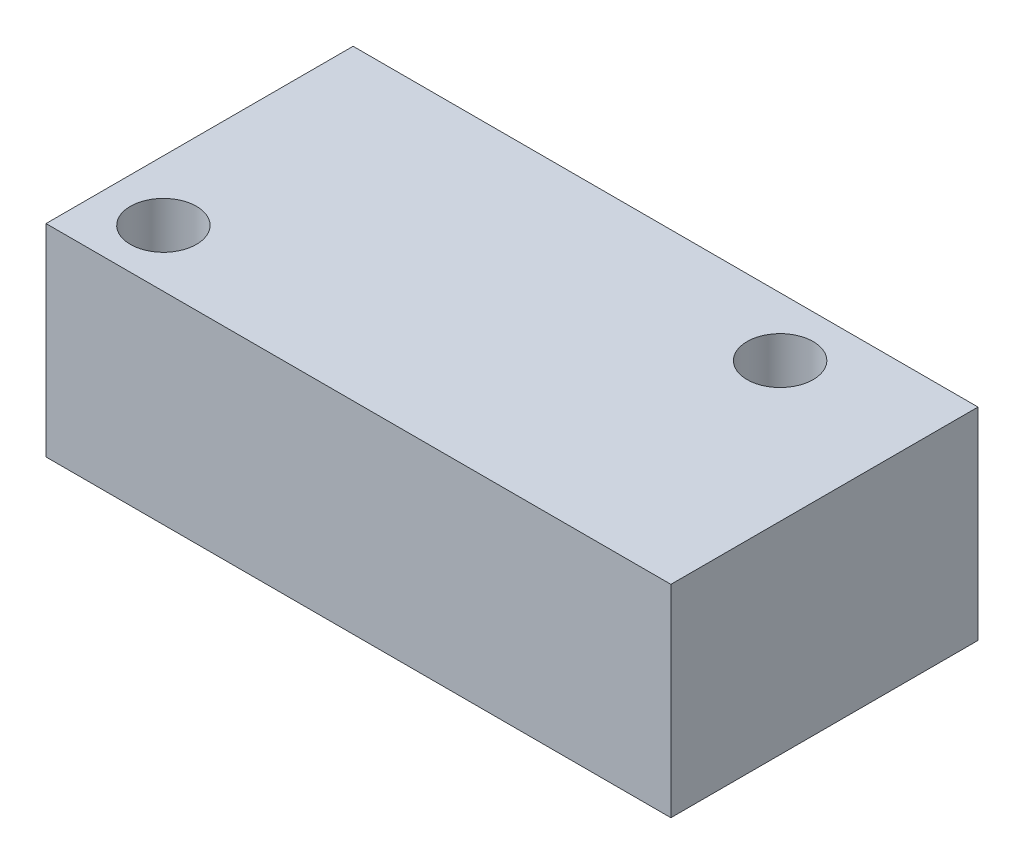
ISO-10303-21;
HEADER;
FILE_DESCRIPTION(('STEP AP214'),'2;1');
FILE_NAME('part.step','',(''),(''),'','','');
FILE_SCHEMA(('AUTOMOTIVE_DESIGN { 1 0 10303 214 1 1 1 1 }'));
ENDSEC;
DATA;
#1=APPLICATION_CONTEXT('core data for automotive mechanical design processes');
#2=APPLICATION_PROTOCOL_DEFINITION('international standard','automotive_design',2000,#1);
#3=PRODUCT_CONTEXT('',#1,'mechanical');
#4=PRODUCT('Part','Part','',(#3));
#5=PRODUCT_RELATED_PRODUCT_CATEGORY('part','',(#4));
#6=PRODUCT_DEFINITION_FORMATION('','',#4);
#7=PRODUCT_DEFINITION_CONTEXT('part definition',#1,'design');
#8=PRODUCT_DEFINITION('design','',#6,#7);
#9=PRODUCT_DEFINITION_SHAPE('','',#8);
#10=(LENGTH_UNIT() NAMED_UNIT(*) SI_UNIT(.MILLI.,.METRE.));
#11=(NAMED_UNIT(*) PLANE_ANGLE_UNIT() SI_UNIT($,.RADIAN.));
#12=(NAMED_UNIT(*) SI_UNIT($,.STERADIAN.) SOLID_ANGLE_UNIT());
#13=UNCERTAINTY_MEASURE_WITH_UNIT(LENGTH_MEASURE(1.E-05),#10,'distance_accuracy_value','');
#14=(GEOMETRIC_REPRESENTATION_CONTEXT(3) GLOBAL_UNCERTAINTY_ASSIGNED_CONTEXT((#13)) GLOBAL_UNIT_ASSIGNED_CONTEXT((#10,
#11,#12)) REPRESENTATION_CONTEXT('',''));
#15=CARTESIAN_POINT('',(0.,0.,0.));
#16=DIRECTION('',(0.,0.,1.));
#17=DIRECTION('',(1.,0.,0.));
#18=AXIS2_PLACEMENT_3D('',#15,#16,#17);
#19=CARTESIAN_POINT('',(0.,10.4,0.));
#20=DIRECTION('',(1.,0.,0.));
#21=DIRECTION('',(0.,0.,-1.));
#22=AXIS2_PLACEMENT_3D('',#19,#20,#21);
#23=PLANE('',#22);
#24=DIRECTION('',(0.,0.,1.));
#25=VECTOR('',#24,1.);
#26=CARTESIAN_POINT('',(0.,0.,0.));
#27=LINE('',#26,#25);
#28=CARTESIAN_POINT('',(0.,0.,-15.8));
#29=VERTEX_POINT('',#28);
#30=CARTESIAN_POINT('',(0.,0.,0.));
#31=VERTEX_POINT('',#30);
#32=EDGE_CURVE('E107',#29,#31,#27,.T.);
#33=ORIENTED_EDGE('',*,*,#32,.T.);
#34=DIRECTION('',(0.,-1.,0.));
#35=VECTOR('',#34,1.);
#36=CARTESIAN_POINT('',(0.,10.4,0.));
#37=LINE('',#36,#35);
#38=CARTESIAN_POINT('',(0.,10.4,0.));
#39=VERTEX_POINT('',#38);
#40=EDGE_CURVE('E11',#39,#31,#37,.T.);
#41=ORIENTED_EDGE('',*,*,#40,.F.);
#42=DIRECTION('',(0.,0.,1.));
#43=VECTOR('',#42,1.);
#44=CARTESIAN_POINT('',(0.,10.4,0.));
#45=LINE('',#44,#43);
#46=CARTESIAN_POINT('',(0.,10.4,-15.8));
#47=VERTEX_POINT('',#46);
#48=EDGE_CURVE('E91',#47,#39,#45,.T.);
#49=ORIENTED_EDGE('',*,*,#48,.F.);
#50=DIRECTION('',(0.,-1.,0.));
#51=VECTOR('',#50,1.);
#52=CARTESIAN_POINT('',(0.,10.4,-15.8));
#53=LINE('',#52,#51);
#54=EDGE_CURVE('E103',#47,#29,#53,.T.);
#55=ORIENTED_EDGE('',*,*,#54,.T.);
#56=EDGE_LOOP('',(#33,#41,#49,#55));
#57=FACE_BOUND('',#56,.T.);
#58=ADVANCED_FACE('F39',(#57),#23,.F.);
#59=CARTESIAN_POINT('',(0.,10.4,0.));
#60=DIRECTION('',(0.,0.,-1.));
#61=DIRECTION('',(-1.,0.,0.));
#62=AXIS2_PLACEMENT_3D('',#59,#60,#61);
#63=PLANE('',#62);
#64=DIRECTION('',(1.,0.,0.));
#65=VECTOR('',#64,1.);
#66=CARTESIAN_POINT('',(0.,0.,0.));
#67=LINE('',#66,#65);
#68=CARTESIAN_POINT('',(32.15,0.,0.));
#69=VERTEX_POINT('',#68);
#70=EDGE_CURVE('E96',#31,#69,#67,.T.);
#71=ORIENTED_EDGE('',*,*,#70,.T.);
#72=DIRECTION('',(0.,-1.,0.));
#73=VECTOR('',#72,1.);
#74=CARTESIAN_POINT('',(32.15,10.4,0.));
#75=LINE('',#74,#73);
#76=CARTESIAN_POINT('',(32.15,10.4,0.));
#77=VERTEX_POINT('',#76);
#78=EDGE_CURVE('E48',#77,#69,#75,.T.);
#79=ORIENTED_EDGE('',*,*,#78,.F.);
#80=DIRECTION('',(1.,0.,0.));
#81=VECTOR('',#80,1.);
#82=CARTESIAN_POINT('',(0.,10.4,0.));
#83=LINE('',#82,#81);
#84=EDGE_CURVE('E86',#39,#77,#83,.T.);
#85=ORIENTED_EDGE('',*,*,#84,.F.);
#86=ORIENTED_EDGE('',*,*,#40,.T.);
#87=EDGE_LOOP('',(#71,#79,#85,#86));
#88=FACE_BOUND('',#87,.T.);
#89=ADVANCED_FACE('F95',(#88),#63,.F.);
#90=CARTESIAN_POINT('',(32.15,10.4,0.));
#91=DIRECTION('',(-1.,0.,0.));
#92=DIRECTION('',(0.,0.,1.));
#93=AXIS2_PLACEMENT_3D('',#90,#91,#92);
#94=PLANE('',#93);
#95=DIRECTION('',(0.,0.,-1.));
#96=VECTOR('',#95,1.);
#97=CARTESIAN_POINT('',(32.15,0.,0.));
#98=LINE('',#97,#96);
#99=CARTESIAN_POINT('',(32.15,0.,-15.8));
#100=VERTEX_POINT('',#99);
#101=EDGE_CURVE('E73',#69,#100,#98,.T.);
#102=ORIENTED_EDGE('',*,*,#101,.T.);
#103=DIRECTION('',(0.,-1.,0.));
#104=VECTOR('',#103,1.);
#105=CARTESIAN_POINT('',(32.15,10.4,-15.8));
#106=LINE('',#105,#104);
#107=CARTESIAN_POINT('',(32.15,10.4,-15.8));
#108=VERTEX_POINT('',#107);
#109=EDGE_CURVE('E98',#108,#100,#106,.T.);
#110=ORIENTED_EDGE('',*,*,#109,.F.);
#111=DIRECTION('',(0.,0.,-1.));
#112=VECTOR('',#111,1.);
#113=CARTESIAN_POINT('',(32.15,10.4,0.));
#114=LINE('',#113,#112);
#115=EDGE_CURVE('E89',#77,#108,#114,.T.);
#116=ORIENTED_EDGE('',*,*,#115,.F.);
#117=ORIENTED_EDGE('',*,*,#78,.T.);
#118=EDGE_LOOP('',(#102,#110,#116,#117));
#119=FACE_BOUND('',#118,.T.);
#120=ADVANCED_FACE('F99',(#119),#94,.F.);
#121=CARTESIAN_POINT('',(0.,10.4,-15.8));
#122=DIRECTION('',(0.,0.,1.));
#123=DIRECTION('',(1.,0.,0.));
#124=AXIS2_PLACEMENT_3D('',#121,#122,#123);
#125=PLANE('',#124);
#126=CARTESIAN_POINT('',(4.87019161215807,5.2,-15.8));
#127=DIRECTION('',(0.,0.,1.));
#128=DIRECTION('',(1.,0.,0.));
#129=AXIS2_PLACEMENT_3D('',#126,#127,#128);
#130=CIRCLE('',#129,4.6);
#131=CARTESIAN_POINT('',(9.47019161215807,5.2,-15.8));
#132=VERTEX_POINT('',#131);
#133=EDGE_CURVE('E151',#132,#132,#130,.T.);
#134=ORIENTED_EDGE('',*,*,#133,.T.);
#135=EDGE_LOOP('',(#134));
#136=FACE_BOUND('',#135,.T.);
#137=DIRECTION('',(-1.,0.,0.));
#138=VECTOR('',#137,1.);
#139=CARTESIAN_POINT('',(0.,0.,-15.8));
#140=LINE('',#139,#138);
#141=EDGE_CURVE('E79',#100,#29,#140,.T.);
#142=ORIENTED_EDGE('',*,*,#141,.T.);
#143=ORIENTED_EDGE('',*,*,#54,.F.);
#144=DIRECTION('',(-1.,0.,0.));
#145=VECTOR('',#144,1.);
#146=CARTESIAN_POINT('',(0.,10.4,-15.8));
#147=LINE('',#146,#145);
#148=EDGE_CURVE('E56',#108,#47,#147,.T.);
#149=ORIENTED_EDGE('',*,*,#148,.F.);
#150=ORIENTED_EDGE('',*,*,#109,.T.);
#151=EDGE_LOOP('',(#142,#143,#149,#150));
#152=FACE_BOUND('',#151,.T.);
#153=ADVANCED_FACE('F121',(#136,#152),#125,.F.);
#154=CARTESIAN_POINT('',(0.,10.4,0.));
#155=DIRECTION('',(0.,-1.,0.));
#156=DIRECTION('',(0.,0.,-1.));
#157=AXIS2_PLACEMENT_3D('',#154,#155,#156);
#158=PLANE('',#157);
#159=CARTESIAN_POINT('',(3.1,10.4,-2.94));
#160=DIRECTION('',(0.,1.,0.));
#161=DIRECTION('',(0.,0.,1.));
#162=AXIS2_PLACEMENT_3D('',#159,#160,#161);
#163=CIRCLE('',#162,1.7);
#164=CARTESIAN_POINT('',(3.1,10.4,-1.24));
#165=VERTEX_POINT('',#164);
#166=EDGE_CURVE('E137',#165,#165,#163,.T.);
#167=ORIENTED_EDGE('',*,*,#166,.F.);
#168=EDGE_LOOP('',(#167));
#169=FACE_BOUND('',#168,.T.);
#170=CARTESIAN_POINT('',(24.99,10.4,-12.78));
#171=DIRECTION('',(0.,1.,0.));
#172=DIRECTION('',(0.,0.,1.));
#173=AXIS2_PLACEMENT_3D('',#170,#171,#172);
#174=CIRCLE('',#173,1.7);
#175=CARTESIAN_POINT('',(24.99,10.4,-11.08));
#176=VERTEX_POINT('',#175);
#177=EDGE_CURVE('E128',#176,#176,#174,.T.);
#178=ORIENTED_EDGE('',*,*,#177,.F.);
#179=EDGE_LOOP('',(#178));
#180=FACE_BOUND('',#179,.T.);
#181=ORIENTED_EDGE('',*,*,#48,.T.);
#182=ORIENTED_EDGE('',*,*,#84,.T.);
#183=ORIENTED_EDGE('',*,*,#115,.T.);
#184=ORIENTED_EDGE('',*,*,#148,.T.);
#185=EDGE_LOOP('',(#181,#182,#183,#184));
#186=FACE_BOUND('',#185,.T.);
#187=ADVANCED_FACE('F87',(#169,#180,#186),#158,.F.);
#188=CARTESIAN_POINT('',(0.,0.,0.));
#189=DIRECTION('',(0.,-1.,0.));
#190=DIRECTION('',(0.,0.,-1.));
#191=AXIS2_PLACEMENT_3D('',#188,#189,#190);
#192=PLANE('',#191);
#193=CARTESIAN_POINT('',(3.1,0.,-2.94));
#194=DIRECTION('',(0.,1.,0.));
#195=DIRECTION('',(0.,0.,1.));
#196=AXIS2_PLACEMENT_3D('',#193,#194,#195);
#197=CIRCLE('',#196,1.7);
#198=CARTESIAN_POINT('',(3.1,0.,-1.24));
#199=VERTEX_POINT('',#198);
#200=EDGE_CURVE('E111',#199,#199,#197,.T.);
#201=ORIENTED_EDGE('',*,*,#200,.T.);
#202=EDGE_LOOP('',(#201));
#203=FACE_BOUND('',#202,.T.);
#204=CARTESIAN_POINT('',(24.99,0.,-12.78));
#205=DIRECTION('',(0.,1.,0.));
#206=DIRECTION('',(0.,0.,1.));
#207=AXIS2_PLACEMENT_3D('',#204,#205,#206);
#208=CIRCLE('',#207,1.7);
#209=CARTESIAN_POINT('',(24.99,0.,-11.08));
#210=VERTEX_POINT('',#209);
#211=EDGE_CURVE('E132',#210,#210,#208,.T.);
#212=ORIENTED_EDGE('',*,*,#211,.T.);
#213=EDGE_LOOP('',(#212));
#214=FACE_BOUND('',#213,.T.);
#215=ORIENTED_EDGE('',*,*,#32,.F.);
#216=ORIENTED_EDGE('',*,*,#141,.F.);
#217=ORIENTED_EDGE('',*,*,#101,.F.);
#218=ORIENTED_EDGE('',*,*,#70,.F.);
#219=EDGE_LOOP('',(#215,#216,#217,#218));
#220=FACE_BOUND('',#219,.T.);
#221=ADVANCED_FACE('F124',(#203,#214,#220),#192,.T.);
#222=CARTESIAN_POINT('',(24.99,0.,-12.78));
#223=DIRECTION('',(0.,1.,0.));
#224=DIRECTION('',(0.,0.,1.));
#225=AXIS2_PLACEMENT_3D('',#222,#223,#224);
#226=CYLINDRICAL_SURFACE('',#225,1.7);
#227=ORIENTED_EDGE('',*,*,#211,.F.);
#228=EDGE_LOOP('',(#227));
#229=FACE_BOUND('',#228,.T.);
#230=ORIENTED_EDGE('',*,*,#177,.T.);
#231=EDGE_LOOP('',(#230));
#232=FACE_BOUND('',#231,.T.);
#233=ADVANCED_FACE('F181',(#229,#232),#226,.F.);
#234=CARTESIAN_POINT('',(3.1,0.,-2.94));
#235=DIRECTION('',(0.,1.,0.));
#236=DIRECTION('',(0.,0.,1.));
#237=AXIS2_PLACEMENT_3D('',#234,#235,#236);
#238=CYLINDRICAL_SURFACE('',#237,1.7);
#239=ORIENTED_EDGE('',*,*,#200,.F.);
#240=EDGE_LOOP('',(#239));
#241=FACE_BOUND('',#240,.T.);
#242=ORIENTED_EDGE('',*,*,#166,.T.);
#243=EDGE_LOOP('',(#242));
#244=FACE_BOUND('',#243,.T.);
#245=ADVANCED_FACE('F188',(#241,#244),#238,.F.);
#246=CARTESIAN_POINT('',(4.87019161215807,5.2,-16.2082485994036));
#247=DIRECTION('',(0.,0.,1.));
#248=DIRECTION('',(1.,0.,0.));
#249=AXIS2_PLACEMENT_3D('',#246,#247,#248);
#250=SPHERICAL_SURFACE('',#249,2.79175140059642);
#251=CARTESIAN_POINT('',(4.87019161215807,5.2,-17.8476794417616));
#252=DIRECTION('',(0.,0.,1.));
#253=DIRECTION('',(1.,0.,0.));
#254=AXIS2_PLACEMENT_3D('',#251,#252,#253);
#255=CIRCLE('',#254,2.25967749819687);
#256=CARTESIAN_POINT('',(7.12986911035493,5.2,-17.8476794417616));
#257=VERTEX_POINT('',#256);
#258=EDGE_CURVE('E133',#257,#257,#255,.T.);
#259=ORIENTED_EDGE('',*,*,#258,.F.);
#260=EDGE_LOOP('',(#259));
#261=FACE_BOUND('',#260,.T.);
#262=ADVANCED_FACE('F165',(#261),#250,.T.);
#263=CARTESIAN_POINT('',(4.87019161215807,5.2,-15.8));
#264=DIRECTION('',(0.,0.,1.));
#265=DIRECTION('',(1.,0.,0.));
#266=AXIS2_PLACEMENT_3D('',#263,#264,#265);
#267=CYLINDRICAL_SURFACE('',#266,2.25967749819687);
#268=ORIENTED_EDGE('',*,*,#258,.T.);
#269=EDGE_LOOP('',(#268));
#270=FACE_BOUND('',#269,.T.);
#271=CARTESIAN_POINT('',(4.87019161215807,5.2,-17.2476794417616));
#272=DIRECTION('',(0.,0.,1.));
#273=DIRECTION('',(1.,0.,0.));
#274=AXIS2_PLACEMENT_3D('',#271,#272,#273);
#275=CIRCLE('',#274,2.25967749819687);
#276=CARTESIAN_POINT('',(7.12986911035493,5.2,-17.2476794417616));
#277=VERTEX_POINT('',#276);
#278=EDGE_CURVE('E147',#277,#277,#275,.T.);
#279=ORIENTED_EDGE('',*,*,#278,.F.);
#280=EDGE_LOOP('',(#279));
#281=FACE_BOUND('',#280,.T.);
#282=ADVANCED_FACE('F159',(#270,#281),#267,.T.);
#283=CARTESIAN_POINT('',(4.87019161215807,5.2,-14.4173582186713));
#284=DIRECTION('',(0.,0.,1.));
#285=DIRECTION('',(1.,0.,0.));
#286=AXIS2_PLACEMENT_3D('',#283,#284,#285);
#287=DEGENERATE_TOROIDAL_SURFACE('',#286,2.12680894750046,2.83343824313142,.T.);
#288=ORIENTED_EDGE('',*,*,#278,.T.);
#289=EDGE_LOOP('',(#288));
#290=FACE_BOUND('',#289,.T.);
#291=ORIENTED_EDGE('',*,*,#133,.F.);
#292=EDGE_LOOP('',(#291));
#293=FACE_BOUND('',#292,.T.);
#294=ADVANCED_FACE('F157',(#290,#293),#287,.T.);
#295=CLOSED_SHELL('',(#58,#89,#120,#153,#187,#221,#233,#245,#262,#282,#294));
#296=MANIFOLD_SOLID_BREP('B2',#295);
#297=ADVANCED_BREP_SHAPE_REPRESENTATION('',(#18,#296),#14);
#298=SHAPE_DEFINITION_REPRESENTATION(#9,#297);
ENDSEC;
END-ISO-10303-21;
